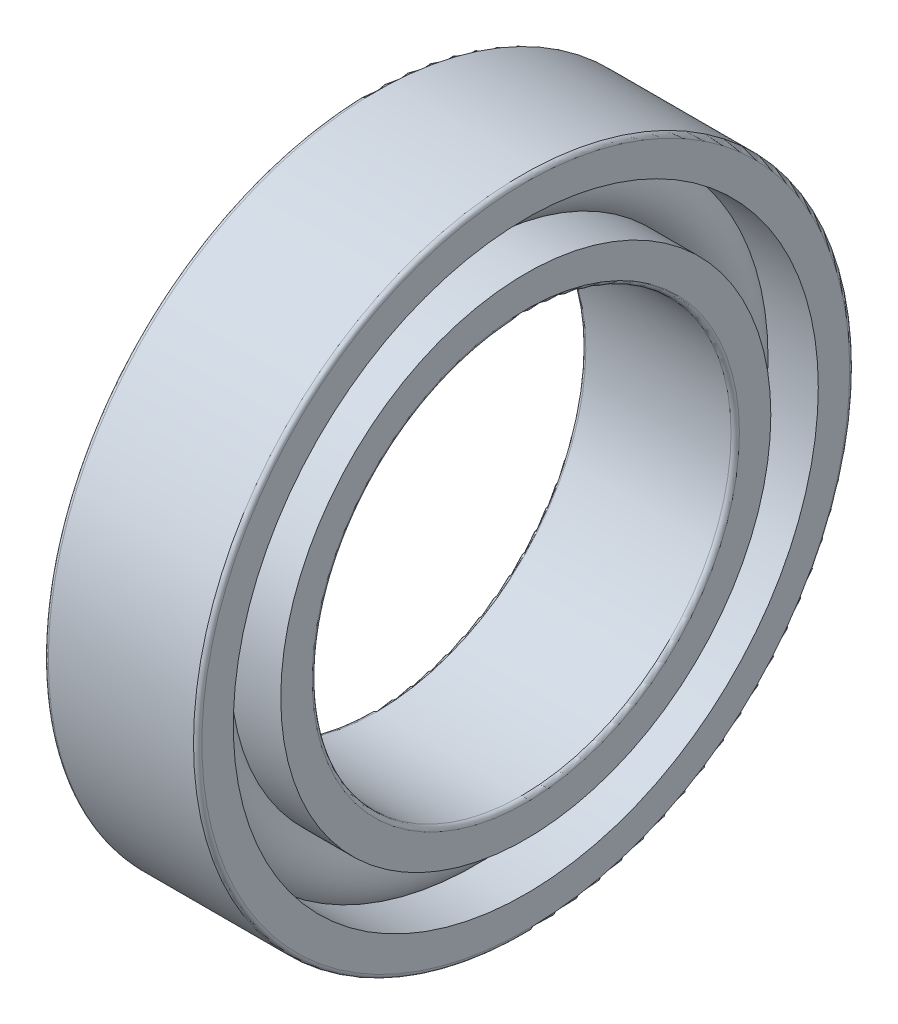
ISO-10303-21;
HEADER;
FILE_DESCRIPTION(('STEP AP214'),'2;1');
FILE_NAME('part.step','',(''),(''),'','','');
FILE_SCHEMA(('AUTOMOTIVE_DESIGN { 1 0 10303 214 1 1 1 1 }'));
ENDSEC;
DATA;
#1=APPLICATION_CONTEXT('core data for automotive mechanical design processes');
#2=APPLICATION_PROTOCOL_DEFINITION('international standard','automotive_design',2000,#1);
#3=PRODUCT_CONTEXT('',#1,'mechanical');
#4=PRODUCT('Part','Part','',(#3));
#5=PRODUCT_RELATED_PRODUCT_CATEGORY('part','',(#4));
#6=PRODUCT_DEFINITION_FORMATION('','',#4);
#7=PRODUCT_DEFINITION_CONTEXT('part definition',#1,'design');
#8=PRODUCT_DEFINITION('design','',#6,#7);
#9=PRODUCT_DEFINITION_SHAPE('','',#8);
#10=(LENGTH_UNIT() NAMED_UNIT(*) SI_UNIT(.MILLI.,.METRE.));
#11=(NAMED_UNIT(*) PLANE_ANGLE_UNIT() SI_UNIT($,.RADIAN.));
#12=(NAMED_UNIT(*) SI_UNIT($,.STERADIAN.) SOLID_ANGLE_UNIT());
#13=UNCERTAINTY_MEASURE_WITH_UNIT(LENGTH_MEASURE(1.E-05),#10,'distance_accuracy_value','');
#14=(GEOMETRIC_REPRESENTATION_CONTEXT(3) GLOBAL_UNCERTAINTY_ASSIGNED_CONTEXT((#13)) GLOBAL_UNIT_ASSIGNED_CONTEXT((#10,
#11,#12)) REPRESENTATION_CONTEXT('',''));
#15=CARTESIAN_POINT('',(0.,0.,0.));
#16=DIRECTION('',(0.,0.,1.));
#17=DIRECTION('',(1.,0.,0.));
#18=AXIS2_PLACEMENT_3D('',#15,#16,#17);
#19=CARTESIAN_POINT('',(0.,0.,0.));
#20=DIRECTION('',(-1.,0.,0.));
#21=DIRECTION('',(0.,0.,1.));
#22=AXIS2_PLACEMENT_3D('',#19,#20,#21);
#23=TOROIDAL_SURFACE('',#22,19.25,2.55);
#24=CARTESIAN_POINT('',(1.90065778087482,0.,0.));
#25=DIRECTION('',(-1.,0.,0.));
#26=DIRECTION('',(0.,0.,1.));
#27=AXIS2_PLACEMENT_3D('',#24,#25,#26);
#28=CIRCLE('',#27,20.95);
#29=CARTESIAN_POINT('',(1.90065778087482,0.,20.95));
#30=VERTEX_POINT('',#29);
#31=EDGE_CURVE('E39',#30,#30,#28,.F.);
#32=ORIENTED_EDGE('',*,*,#31,.T.);
#33=EDGE_LOOP('',(#32));
#34=FACE_BOUND('',#33,.T.);
#35=CARTESIAN_POINT('',(1.90065778087482,0.,0.));
#36=DIRECTION('',(-1.,0.,0.));
#37=DIRECTION('',(0.,0.,1.));
#38=AXIS2_PLACEMENT_3D('',#35,#36,#37);
#39=CIRCLE('',#38,17.55);
#40=CARTESIAN_POINT('',(1.90065778087482,0.,17.55));
#41=VERTEX_POINT('',#40);
#42=EDGE_CURVE('E10',#41,#41,#39,.T.);
#43=ORIENTED_EDGE('',*,*,#42,.T.);
#44=EDGE_LOOP('',(#43));
#45=FACE_BOUND('',#44,.T.);
#46=ADVANCED_FACE('F35',(#34,#45),#23,.T.);
#47=CARTESIAN_POINT('',(-20.6375,0.,0.));
#48=DIRECTION('',(1.,0.,0.));
#49=DIRECTION('',(0.,0.,-1.));
#50=AXIS2_PLACEMENT_3D('',#47,#48,#49);
#51=CYLINDRICAL_SURFACE('',#50,17.55);
#52=CARTESIAN_POINT('',(5.5,0.,0.));
#53=DIRECTION('',(1.,0.,0.));
#54=DIRECTION('',(0.,0.,-1.));
#55=AXIS2_PLACEMENT_3D('',#52,#53,#54);
#56=CIRCLE('',#55,17.55);
#57=CARTESIAN_POINT('',(5.5,0.,-17.55));
#58=VERTEX_POINT('',#57);
#59=EDGE_CURVE('E48',#58,#58,#56,.T.);
#60=ORIENTED_EDGE('',*,*,#59,.F.);
#61=EDGE_LOOP('',(#60));
#62=FACE_BOUND('',#61,.T.);
#63=ORIENTED_EDGE('',*,*,#42,.F.);
#64=EDGE_LOOP('',(#63));
#65=FACE_BOUND('',#64,.T.);
#66=ADVANCED_FACE('F87',(#62,#65),#51,.T.);
#67=CARTESIAN_POINT('',(-20.6375,0.,0.));
#68=DIRECTION('',(1.,0.,0.));
#69=DIRECTION('',(0.,0.,-1.));
#70=AXIS2_PLACEMENT_3D('',#67,#68,#69);
#71=CYLINDRICAL_SURFACE('',#70,17.55);
#72=CARTESIAN_POINT('',(-5.5,0.,0.));
#73=DIRECTION('',(1.,0.,0.));
#74=DIRECTION('',(0.,0.,-1.));
#75=AXIS2_PLACEMENT_3D('',#72,#73,#74);
#76=CIRCLE('',#75,17.55);
#77=CARTESIAN_POINT('',(-5.5,0.,-17.55));
#78=VERTEX_POINT('',#77);
#79=EDGE_CURVE('E57',#78,#78,#76,.T.);
#80=ORIENTED_EDGE('',*,*,#79,.T.);
#81=EDGE_LOOP('',(#80));
#82=FACE_BOUND('',#81,.T.);
#83=CARTESIAN_POINT('',(-1.90065778087482,0.,0.));
#84=DIRECTION('',(1.,0.,0.));
#85=DIRECTION('',(0.,0.,-1.));
#86=AXIS2_PLACEMENT_3D('',#83,#84,#85);
#87=CIRCLE('',#86,17.55);
#88=CARTESIAN_POINT('',(-1.90065778087482,0.,-17.55));
#89=VERTEX_POINT('',#88);
#90=EDGE_CURVE('E43',#89,#89,#87,.T.);
#91=ORIENTED_EDGE('',*,*,#90,.F.);
#92=EDGE_LOOP('',(#91));
#93=FACE_BOUND('',#92,.T.);
#94=ADVANCED_FACE('F90',(#82,#93),#71,.T.);
#95=CARTESIAN_POINT('',(5.5,15.3,0.));
#96=DIRECTION('',(1.,0.,0.));
#97=DIRECTION('',(0.,0.,-1.));
#98=AXIS2_PLACEMENT_3D('',#95,#96,#97);
#99=PLANE('',#98);
#100=ORIENTED_EDGE('',*,*,#59,.T.);
#101=EDGE_LOOP('',(#100));
#102=FACE_BOUND('',#101,.T.);
#103=CARTESIAN_POINT('',(5.5,0.,0.));
#104=DIRECTION('',(1.,0.,0.));
#105=DIRECTION('',(0.,0.,-1.));
#106=AXIS2_PLACEMENT_3D('',#103,#104,#105);
#107=CIRCLE('',#106,15.3);
#108=CARTESIAN_POINT('',(5.5,0.,-15.3));
#109=VERTEX_POINT('',#108);
#110=EDGE_CURVE('E79',#109,#109,#107,.T.);
#111=ORIENTED_EDGE('',*,*,#110,.F.);
#112=EDGE_LOOP('',(#111));
#113=FACE_BOUND('',#112,.T.);
#114=ADVANCED_FACE('F84',(#102,#113),#99,.T.);
#115=CARTESIAN_POINT('',(5.2,0.,0.));
#116=DIRECTION('',(1.,0.,0.));
#117=DIRECTION('',(0.,0.,-1.));
#118=AXIS2_PLACEMENT_3D('',#115,#116,#117);
#119=TOROIDAL_SURFACE('',#118,15.3,0.3);
#120=ORIENTED_EDGE('',*,*,#110,.T.);
#121=EDGE_LOOP('',(#120));
#122=FACE_BOUND('',#121,.T.);
#123=CARTESIAN_POINT('',(5.2,0.,0.));
#124=DIRECTION('',(1.,0.,0.));
#125=DIRECTION('',(0.,0.,-1.));
#126=AXIS2_PLACEMENT_3D('',#123,#124,#125);
#127=CIRCLE('',#126,15.);
#128=CARTESIAN_POINT('',(5.2,0.,-15.));
#129=VERTEX_POINT('',#128);
#130=EDGE_CURVE('E76',#129,#129,#127,.T.);
#131=ORIENTED_EDGE('',*,*,#130,.F.);
#132=EDGE_LOOP('',(#131));
#133=FACE_BOUND('',#132,.T.);
#134=ADVANCED_FACE('F101',(#122,#133),#119,.T.);
#135=CARTESIAN_POINT('',(-20.6375,0.,0.));
#136=DIRECTION('',(1.,0.,0.));
#137=DIRECTION('',(0.,0.,-1.));
#138=AXIS2_PLACEMENT_3D('',#135,#136,#137);
#139=CYLINDRICAL_SURFACE('',#138,15.);
#140=ORIENTED_EDGE('',*,*,#130,.T.);
#141=EDGE_LOOP('',(#140));
#142=FACE_BOUND('',#141,.T.);
#143=CARTESIAN_POINT('',(-5.2,0.,0.));
#144=DIRECTION('',(1.,0.,0.));
#145=DIRECTION('',(0.,0.,-1.));
#146=AXIS2_PLACEMENT_3D('',#143,#144,#145);
#147=CIRCLE('',#146,15.);
#148=CARTESIAN_POINT('',(-5.2,0.,-15.));
#149=VERTEX_POINT('',#148);
#150=EDGE_CURVE('E73',#149,#149,#147,.T.);
#151=ORIENTED_EDGE('',*,*,#150,.F.);
#152=EDGE_LOOP('',(#151));
#153=FACE_BOUND('',#152,.T.);
#154=ADVANCED_FACE('F104',(#142,#153),#139,.F.);
#155=CARTESIAN_POINT('',(-5.2,0.,0.));
#156=DIRECTION('',(1.,0.,0.));
#157=DIRECTION('',(0.,0.,-1.));
#158=AXIS2_PLACEMENT_3D('',#155,#156,#157);
#159=TOROIDAL_SURFACE('',#158,15.3,0.3);
#160=ORIENTED_EDGE('',*,*,#150,.T.);
#161=EDGE_LOOP('',(#160));
#162=FACE_BOUND('',#161,.T.);
#163=CARTESIAN_POINT('',(-5.5,0.,0.));
#164=DIRECTION('',(1.,0.,0.));
#165=DIRECTION('',(0.,0.,-1.));
#166=AXIS2_PLACEMENT_3D('',#163,#164,#165);
#167=CIRCLE('',#166,15.3);
#168=CARTESIAN_POINT('',(-5.5,0.,-15.3));
#169=VERTEX_POINT('',#168);
#170=EDGE_CURVE('E70',#169,#169,#167,.T.);
#171=ORIENTED_EDGE('',*,*,#170,.F.);
#172=EDGE_LOOP('',(#171));
#173=FACE_BOUND('',#172,.T.);
#174=ADVANCED_FACE('F108',(#162,#173),#159,.T.);
#175=CARTESIAN_POINT('',(-5.5,17.55,0.));
#176=DIRECTION('',(-1.,0.,0.));
#177=DIRECTION('',(0.,0.,1.));
#178=AXIS2_PLACEMENT_3D('',#175,#176,#177);
#179=PLANE('',#178);
#180=ORIENTED_EDGE('',*,*,#170,.T.);
#181=EDGE_LOOP('',(#180));
#182=FACE_BOUND('',#181,.T.);
#183=ORIENTED_EDGE('',*,*,#79,.F.);
#184=EDGE_LOOP('',(#183));
#185=FACE_BOUND('',#184,.T.);
#186=ADVANCED_FACE('F112',(#182,#185),#179,.T.);
#187=CARTESIAN_POINT('',(-1.90065778087482,0.,0.));
#188=DIRECTION('',(1.,0.,0.));
#189=DIRECTION('',(0.,0.,-1.));
#190=AXIS2_PLACEMENT_3D('',#187,#188,#189);
#191=CIRCLE('',#190,20.95);
#192=CARTESIAN_POINT('',(-1.90065778087482,0.,-20.95));
#193=VERTEX_POINT('',#192);
#194=EDGE_CURVE('E51',#193,#193,#191,.F.);
#195=ORIENTED_EDGE('',*,*,#194,.T.);
#196=EDGE_LOOP('',(#195));
#197=FACE_BOUND('',#196,.T.);
#198=ORIENTED_EDGE('',*,*,#90,.T.);
#199=EDGE_LOOP('',(#198));
#200=FACE_BOUND('',#199,.T.);
#201=ADVANCED_FACE('F37',(#197,#200),#23,.T.);
#202=CARTESIAN_POINT('',(-20.6375,0.,0.));
#203=DIRECTION('',(1.,0.,0.));
#204=DIRECTION('',(0.,0.,-1.));
#205=AXIS2_PLACEMENT_3D('',#202,#203,#204);
#206=CYLINDRICAL_SURFACE('',#205,20.95);
#207=CARTESIAN_POINT('',(5.5,0.,0.));
#208=DIRECTION('',(1.,0.,0.));
#209=DIRECTION('',(0.,0.,-1.));
#210=AXIS2_PLACEMENT_3D('',#207,#208,#209);
#211=CIRCLE('',#210,20.95);
#212=CARTESIAN_POINT('',(5.5,0.,-20.95));
#213=VERTEX_POINT('',#212);
#214=EDGE_CURVE('E53',#213,#213,#211,.T.);
#215=ORIENTED_EDGE('',*,*,#214,.T.);
#216=EDGE_LOOP('',(#215));
#217=FACE_BOUND('',#216,.T.);
#218=ORIENTED_EDGE('',*,*,#31,.F.);
#219=EDGE_LOOP('',(#218));
#220=FACE_BOUND('',#219,.T.);
#221=ADVANCED_FACE('F117',(#217,#220),#206,.F.);
#222=CARTESIAN_POINT('',(-20.6375,0.,0.));
#223=DIRECTION('',(1.,0.,0.));
#224=DIRECTION('',(0.,0.,-1.));
#225=AXIS2_PLACEMENT_3D('',#222,#223,#224);
#226=CYLINDRICAL_SURFACE('',#225,20.95);
#227=CARTESIAN_POINT('',(-5.5,0.,0.));
#228=DIRECTION('',(1.,0.,0.));
#229=DIRECTION('',(0.,0.,-1.));
#230=AXIS2_PLACEMENT_3D('',#227,#228,#229);
#231=CIRCLE('',#230,20.95);
#232=CARTESIAN_POINT('',(-5.5,0.,-20.95));
#233=VERTEX_POINT('',#232);
#234=EDGE_CURVE('E148',#233,#233,#231,.T.);
#235=ORIENTED_EDGE('',*,*,#234,.F.);
#236=EDGE_LOOP('',(#235));
#237=FACE_BOUND('',#236,.T.);
#238=ORIENTED_EDGE('',*,*,#194,.F.);
#239=EDGE_LOOP('',(#238));
#240=FACE_BOUND('',#239,.T.);
#241=ADVANCED_FACE('F120',(#237,#240),#226,.F.);
#242=CARTESIAN_POINT('',(5.5,23.2,0.));
#243=DIRECTION('',(1.,0.,0.));
#244=DIRECTION('',(0.,0.,-1.));
#245=AXIS2_PLACEMENT_3D('',#242,#243,#244);
#246=PLANE('',#245);
#247=CARTESIAN_POINT('',(5.5,0.,0.));
#248=DIRECTION('',(1.,0.,0.));
#249=DIRECTION('',(0.,0.,-1.));
#250=AXIS2_PLACEMENT_3D('',#247,#248,#249);
#251=CIRCLE('',#250,23.2);
#252=CARTESIAN_POINT('',(5.5,0.,-23.2));
#253=VERTEX_POINT('',#252);
#254=EDGE_CURVE('E59',#253,#253,#251,.T.);
#255=ORIENTED_EDGE('',*,*,#254,.T.);
#256=EDGE_LOOP('',(#255));
#257=FACE_BOUND('',#256,.T.);
#258=ORIENTED_EDGE('',*,*,#214,.F.);
#259=EDGE_LOOP('',(#258));
#260=FACE_BOUND('',#259,.T.);
#261=ADVANCED_FACE('F121',(#257,#260),#246,.T.);
#262=CARTESIAN_POINT('',(5.2,0.,0.));
#263=DIRECTION('',(1.,0.,0.));
#264=DIRECTION('',(0.,0.,-1.));
#265=AXIS2_PLACEMENT_3D('',#262,#263,#264);
#266=TOROIDAL_SURFACE('',#265,23.2,0.299999999999999);
#267=CARTESIAN_POINT('',(5.2,0.,0.));
#268=DIRECTION('',(1.,0.,0.));
#269=DIRECTION('',(0.,0.,-1.));
#270=AXIS2_PLACEMENT_3D('',#267,#268,#269);
#271=CIRCLE('',#270,23.5);
#272=CARTESIAN_POINT('',(5.2,0.,-23.5));
#273=VERTEX_POINT('',#272);
#274=EDGE_CURVE('E64',#273,#273,#271,.T.);
#275=ORIENTED_EDGE('',*,*,#274,.T.);
#276=EDGE_LOOP('',(#275));
#277=FACE_BOUND('',#276,.T.);
#278=ORIENTED_EDGE('',*,*,#254,.F.);
#279=EDGE_LOOP('',(#278));
#280=FACE_BOUND('',#279,.T.);
#281=ADVANCED_FACE('F124',(#277,#280),#266,.T.);
#282=CARTESIAN_POINT('',(-20.6375,0.,0.));
#283=DIRECTION('',(1.,0.,0.));
#284=DIRECTION('',(0.,0.,-1.));
#285=AXIS2_PLACEMENT_3D('',#282,#283,#284);
#286=CYLINDRICAL_SURFACE('',#285,23.5);
#287=CARTESIAN_POINT('',(-5.2,0.,0.));
#288=DIRECTION('',(1.,0.,0.));
#289=DIRECTION('',(0.,0.,-1.));
#290=AXIS2_PLACEMENT_3D('',#287,#288,#289);
#291=CIRCLE('',#290,23.5);
#292=CARTESIAN_POINT('',(-5.2,0.,-23.5));
#293=VERTEX_POINT('',#292);
#294=EDGE_CURVE('E152',#293,#293,#291,.T.);
#295=ORIENTED_EDGE('',*,*,#294,.T.);
#296=EDGE_LOOP('',(#295));
#297=FACE_BOUND('',#296,.T.);
#298=ORIENTED_EDGE('',*,*,#274,.F.);
#299=EDGE_LOOP('',(#298));
#300=FACE_BOUND('',#299,.T.);
#301=ADVANCED_FACE('F128',(#297,#300),#286,.T.);
#302=CARTESIAN_POINT('',(-5.2,0.,0.));
#303=DIRECTION('',(1.,0.,0.));
#304=DIRECTION('',(0.,0.,-1.));
#305=AXIS2_PLACEMENT_3D('',#302,#303,#304);
#306=TOROIDAL_SURFACE('',#305,23.2,0.299999999999999);
#307=CARTESIAN_POINT('',(-5.5,0.,0.));
#308=DIRECTION('',(1.,0.,0.));
#309=DIRECTION('',(0.,0.,-1.));
#310=AXIS2_PLACEMENT_3D('',#307,#308,#309);
#311=CIRCLE('',#310,23.2);
#312=CARTESIAN_POINT('',(-5.5,0.,-23.2));
#313=VERTEX_POINT('',#312);
#314=EDGE_CURVE('E149',#313,#313,#311,.T.);
#315=ORIENTED_EDGE('',*,*,#314,.T.);
#316=EDGE_LOOP('',(#315));
#317=FACE_BOUND('',#316,.T.);
#318=ORIENTED_EDGE('',*,*,#294,.F.);
#319=EDGE_LOOP('',(#318));
#320=FACE_BOUND('',#319,.T.);
#321=ADVANCED_FACE('F132',(#317,#320),#306,.T.);
#322=CARTESIAN_POINT('',(-5.5,20.95,0.));
#323=DIRECTION('',(-1.,0.,0.));
#324=DIRECTION('',(0.,0.,1.));
#325=AXIS2_PLACEMENT_3D('',#322,#323,#324);
#326=PLANE('',#325);
#327=ORIENTED_EDGE('',*,*,#234,.T.);
#328=EDGE_LOOP('',(#327));
#329=FACE_BOUND('',#328,.T.);
#330=ORIENTED_EDGE('',*,*,#314,.F.);
#331=EDGE_LOOP('',(#330));
#332=FACE_BOUND('',#331,.T.);
#333=ADVANCED_FACE('F136',(#329,#332),#326,.T.);
#334=CLOSED_SHELL('',(#46,#66,#94,#114,#134,#154,#174,#186,#201,#221,#241,#261,#281,#301,#321,#333));
#335=MANIFOLD_SOLID_BREP('B2',#334);
#336=ADVANCED_BREP_SHAPE_REPRESENTATION('',(#18,#335),#14);
#337=SHAPE_DEFINITION_REPRESENTATION(#9,#336);
ENDSEC;
END-ISO-10303-21;
